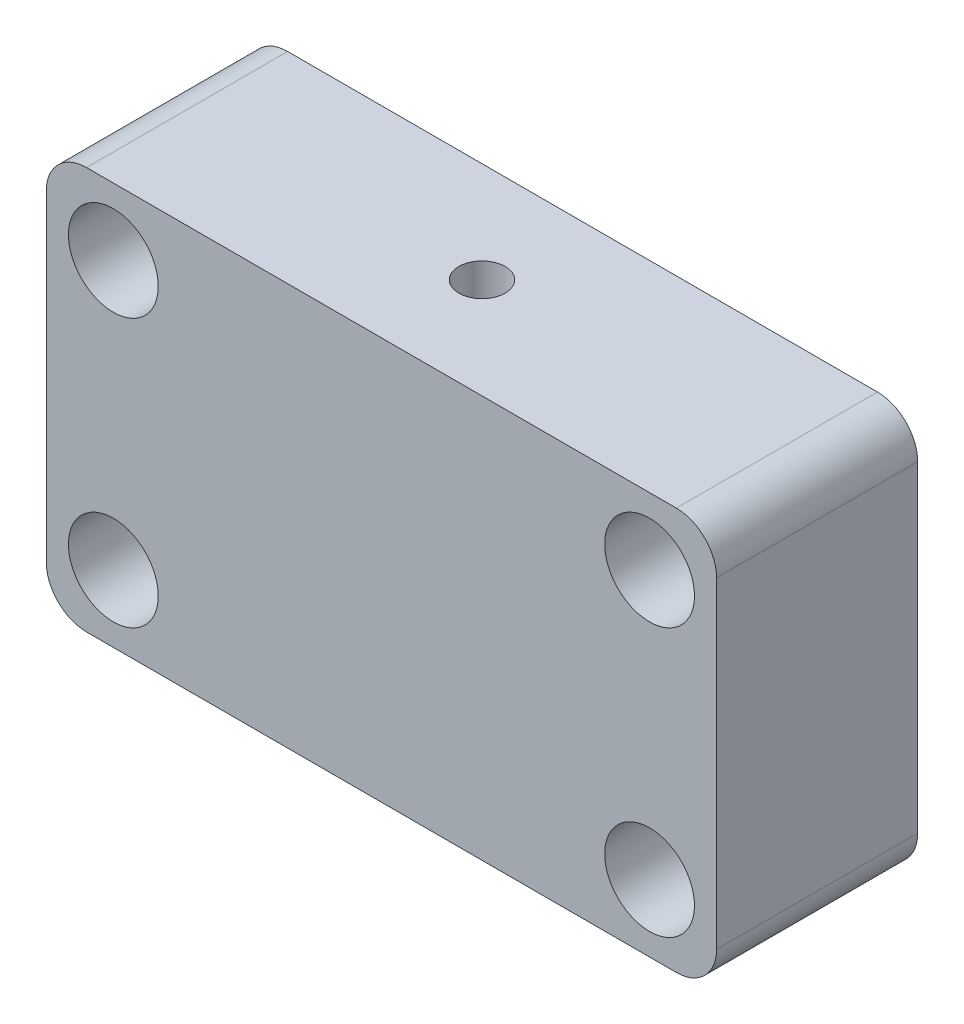
ISO-10303-21;
HEADER;
FILE_DESCRIPTION(('STEP AP214'),'2;1');
FILE_NAME('part.step','',(''),(''),'','','');
FILE_SCHEMA(('AUTOMOTIVE_DESIGN { 1 0 10303 214 1 1 1 1 }'));
ENDSEC;
DATA;
#1=APPLICATION_CONTEXT('core data for automotive mechanical design processes');
#2=APPLICATION_PROTOCOL_DEFINITION('international standard','automotive_design',2000,#1);
#3=PRODUCT_CONTEXT('',#1,'mechanical');
#4=PRODUCT('Part','Part','',(#3));
#5=PRODUCT_RELATED_PRODUCT_CATEGORY('part','',(#4));
#6=PRODUCT_DEFINITION_FORMATION('','',#4);
#7=PRODUCT_DEFINITION_CONTEXT('part definition',#1,'design');
#8=PRODUCT_DEFINITION('design','',#6,#7);
#9=PRODUCT_DEFINITION_SHAPE('','',#8);
#10=(LENGTH_UNIT() NAMED_UNIT(*) SI_UNIT(.MILLI.,.METRE.));
#11=(NAMED_UNIT(*) PLANE_ANGLE_UNIT() SI_UNIT($,.RADIAN.));
#12=(NAMED_UNIT(*) SI_UNIT($,.STERADIAN.) SOLID_ANGLE_UNIT());
#13=UNCERTAINTY_MEASURE_WITH_UNIT(LENGTH_MEASURE(1.E-05),#10,'distance_accuracy_value','');
#14=(GEOMETRIC_REPRESENTATION_CONTEXT(3) GLOBAL_UNCERTAINTY_ASSIGNED_CONTEXT((#13)) GLOBAL_UNIT_ASSIGNED_CONTEXT((#10,
#11,#12)) REPRESENTATION_CONTEXT('',''));
#15=CARTESIAN_POINT('',(0.,0.,0.));
#16=DIRECTION('',(0.,0.,1.));
#17=DIRECTION('',(1.,0.,0.));
#18=AXIS2_PLACEMENT_3D('',#15,#16,#17);
#19=CARTESIAN_POINT('',(0.,0.,15.));
#20=DIRECTION('',(0.,0.,-1.));
#21=DIRECTION('',(-1.,0.,0.));
#22=AXIS2_PLACEMENT_3D('',#19,#20,#21);
#23=PLANE('',#22);
#24=DIRECTION('',(0.,-1.,0.));
#25=VECTOR('',#24,1.);
#26=CARTESIAN_POINT('',(-25.,-15.,15.));
#27=LINE('',#26,#25);
#28=CARTESIAN_POINT('',(-25.,12.,15.));
#29=VERTEX_POINT('',#28);
#30=CARTESIAN_POINT('',(-25.,-12.,15.));
#31=VERTEX_POINT('',#30);
#32=EDGE_CURVE('E148',#29,#31,#27,.T.);
#33=ORIENTED_EDGE('',*,*,#32,.T.);
#34=CARTESIAN_POINT('',(-22.,-12.,15.));
#35=DIRECTION('',(0.,0.,-1.));
#36=DIRECTION('',(-1.,0.,0.));
#37=AXIS2_PLACEMENT_3D('',#34,#35,#36);
#38=CIRCLE('',#37,3.);
#39=CARTESIAN_POINT('',(-22.,-15.,15.));
#40=VERTEX_POINT('',#39);
#41=EDGE_CURVE('E11',#31,#40,#38,.F.);
#42=ORIENTED_EDGE('',*,*,#41,.T.);
#43=DIRECTION('',(1.,0.,0.));
#44=VECTOR('',#43,1.);
#45=CARTESIAN_POINT('',(-25.,-15.,15.));
#46=LINE('',#45,#44);
#47=CARTESIAN_POINT('',(22.,-15.,15.));
#48=VERTEX_POINT('',#47);
#49=EDGE_CURVE('E150',#40,#48,#46,.T.);
#50=ORIENTED_EDGE('',*,*,#49,.T.);
#51=CARTESIAN_POINT('',(22.,-12.,15.));
#52=DIRECTION('',(0.,0.,-1.));
#53=DIRECTION('',(-1.,0.,0.));
#54=AXIS2_PLACEMENT_3D('',#51,#52,#53);
#55=CIRCLE('',#54,3.);
#56=CARTESIAN_POINT('',(25.,-12.,15.));
#57=VERTEX_POINT('',#56);
#58=EDGE_CURVE('E188',#48,#57,#55,.F.);
#59=ORIENTED_EDGE('',*,*,#58,.T.);
#60=DIRECTION('',(0.,1.,0.));
#61=VECTOR('',#60,1.);
#62=CARTESIAN_POINT('',(25.,-15.,15.));
#63=LINE('',#62,#61);
#64=CARTESIAN_POINT('',(25.,12.,15.));
#65=VERTEX_POINT('',#64);
#66=EDGE_CURVE('E142',#57,#65,#63,.T.);
#67=ORIENTED_EDGE('',*,*,#66,.T.);
#68=CARTESIAN_POINT('',(22.,12.,15.));
#69=DIRECTION('',(0.,0.,-1.));
#70=DIRECTION('',(-1.,0.,0.));
#71=AXIS2_PLACEMENT_3D('',#68,#69,#70);
#72=CIRCLE('',#71,3.);
#73=CARTESIAN_POINT('',(22.,15.,15.));
#74=VERTEX_POINT('',#73);
#75=EDGE_CURVE('E168',#65,#74,#72,.F.);
#76=ORIENTED_EDGE('',*,*,#75,.T.);
#77=DIRECTION('',(-1.,0.,0.));
#78=VECTOR('',#77,1.);
#79=CARTESIAN_POINT('',(-25.,15.,15.));
#80=LINE('',#79,#78);
#81=CARTESIAN_POINT('',(-22.,15.,15.));
#82=VERTEX_POINT('',#81);
#83=EDGE_CURVE('E144',#74,#82,#80,.T.);
#84=ORIENTED_EDGE('',*,*,#83,.T.);
#85=CARTESIAN_POINT('',(-22.,12.,15.));
#86=DIRECTION('',(0.,0.,-1.));
#87=DIRECTION('',(-1.,0.,0.));
#88=AXIS2_PLACEMENT_3D('',#85,#86,#87);
#89=CIRCLE('',#88,3.);
#90=EDGE_CURVE('E177',#82,#29,#89,.F.);
#91=ORIENTED_EDGE('',*,*,#90,.T.);
#92=EDGE_LOOP('',(#33,#42,#50,#59,#67,#76,#84,#91));
#93=FACE_BOUND('',#92,.T.);
#94=CARTESIAN_POINT('',(-20.,10.,15.));
#95=DIRECTION('',(0.,0.,1.));
#96=DIRECTION('',(1.,0.,0.));
#97=AXIS2_PLACEMENT_3D('',#94,#95,#96);
#98=CIRCLE('',#97,3.35);
#99=CARTESIAN_POINT('',(-16.65,10.,15.));
#100=VERTEX_POINT('',#99);
#101=EDGE_CURVE('E136',#100,#100,#98,.T.);
#102=ORIENTED_EDGE('',*,*,#101,.F.);
#103=EDGE_LOOP('',(#102));
#104=FACE_BOUND('',#103,.T.);
#105=CARTESIAN_POINT('',(20.,10.,15.));
#106=DIRECTION('',(0.,0.,1.));
#107=DIRECTION('',(1.,0.,0.));
#108=AXIS2_PLACEMENT_3D('',#105,#106,#107);
#109=CIRCLE('',#108,3.35);
#110=CARTESIAN_POINT('',(23.35,10.,15.));
#111=VERTEX_POINT('',#110);
#112=EDGE_CURVE('E130',#111,#111,#109,.T.);
#113=ORIENTED_EDGE('',*,*,#112,.F.);
#114=EDGE_LOOP('',(#113));
#115=FACE_BOUND('',#114,.T.);
#116=CARTESIAN_POINT('',(-20.,-10.,15.));
#117=DIRECTION('',(0.,0.,1.));
#118=DIRECTION('',(1.,0.,0.));
#119=AXIS2_PLACEMENT_3D('',#116,#117,#118);
#120=CIRCLE('',#119,3.35);
#121=CARTESIAN_POINT('',(-16.65,-10.,15.));
#122=VERTEX_POINT('',#121);
#123=EDGE_CURVE('E124',#122,#122,#120,.T.);
#124=ORIENTED_EDGE('',*,*,#123,.F.);
#125=EDGE_LOOP('',(#124));
#126=FACE_BOUND('',#125,.T.);
#127=CARTESIAN_POINT('',(20.,-10.,15.));
#128=DIRECTION('',(0.,0.,1.));
#129=DIRECTION('',(1.,0.,0.));
#130=AXIS2_PLACEMENT_3D('',#127,#128,#129);
#131=CIRCLE('',#130,3.35);
#132=CARTESIAN_POINT('',(23.35,-10.,15.));
#133=VERTEX_POINT('',#132);
#134=EDGE_CURVE('E116',#133,#133,#131,.T.);
#135=ORIENTED_EDGE('',*,*,#134,.F.);
#136=EDGE_LOOP('',(#135));
#137=FACE_BOUND('',#136,.T.);
#138=ADVANCED_FACE('F36',(#93,#104,#115,#126,#137),#23,.F.);
#139=CARTESIAN_POINT('',(0.,0.,0.));
#140=DIRECTION('',(0.,0.,-1.));
#141=DIRECTION('',(-1.,0.,0.));
#142=AXIS2_PLACEMENT_3D('',#139,#140,#141);
#143=PLANE('',#142);
#144=CARTESIAN_POINT('',(-20.,-10.,0.));
#145=DIRECTION('',(0.,0.,1.));
#146=DIRECTION('',(1.,0.,0.));
#147=AXIS2_PLACEMENT_3D('',#144,#145,#146);
#148=CIRCLE('',#147,3.35);
#149=CARTESIAN_POINT('',(-16.65,-10.,0.));
#150=VERTEX_POINT('',#149);
#151=EDGE_CURVE('E122',#150,#150,#148,.T.);
#152=ORIENTED_EDGE('',*,*,#151,.T.);
#153=EDGE_LOOP('',(#152));
#154=FACE_BOUND('',#153,.T.);
#155=CARTESIAN_POINT('',(-20.,10.,0.));
#156=DIRECTION('',(0.,0.,1.));
#157=DIRECTION('',(1.,0.,0.));
#158=AXIS2_PLACEMENT_3D('',#155,#156,#157);
#159=CIRCLE('',#158,3.35);
#160=CARTESIAN_POINT('',(-16.65,10.,0.));
#161=VERTEX_POINT('',#160);
#162=EDGE_CURVE('E133',#161,#161,#159,.T.);
#163=ORIENTED_EDGE('',*,*,#162,.T.);
#164=EDGE_LOOP('',(#163));
#165=FACE_BOUND('',#164,.T.);
#166=DIRECTION('',(1.,0.,0.));
#167=VECTOR('',#166,1.);
#168=CARTESIAN_POINT('',(-25.,-15.,0.));
#169=LINE('',#168,#167);
#170=CARTESIAN_POINT('',(-22.,-15.,0.));
#171=VERTEX_POINT('',#170);
#172=CARTESIAN_POINT('',(22.,-15.,0.));
#173=VERTEX_POINT('',#172);
#174=EDGE_CURVE('E145',#171,#173,#169,.T.);
#175=ORIENTED_EDGE('',*,*,#174,.F.);
#176=CARTESIAN_POINT('',(-22.,-12.,0.));
#177=DIRECTION('',(0.,0.,-1.));
#178=DIRECTION('',(-1.,0.,0.));
#179=AXIS2_PLACEMENT_3D('',#176,#177,#178);
#180=CIRCLE('',#179,3.);
#181=CARTESIAN_POINT('',(-25.,-12.,0.));
#182=VERTEX_POINT('',#181);
#183=EDGE_CURVE('E58',#171,#182,#180,.T.);
#184=ORIENTED_EDGE('',*,*,#183,.T.);
#185=DIRECTION('',(0.,-1.,0.));
#186=VECTOR('',#185,1.);
#187=CARTESIAN_POINT('',(-25.,-15.,0.));
#188=LINE('',#187,#186);
#189=CARTESIAN_POINT('',(-25.,12.,0.));
#190=VERTEX_POINT('',#189);
#191=EDGE_CURVE('E157',#190,#182,#188,.T.);
#192=ORIENTED_EDGE('',*,*,#191,.F.);
#193=CARTESIAN_POINT('',(-22.,12.,0.));
#194=DIRECTION('',(0.,0.,-1.));
#195=DIRECTION('',(-1.,0.,0.));
#196=AXIS2_PLACEMENT_3D('',#193,#194,#195);
#197=CIRCLE('',#196,3.);
#198=CARTESIAN_POINT('',(-22.,15.,0.));
#199=VERTEX_POINT('',#198);
#200=EDGE_CURVE('E173',#190,#199,#197,.T.);
#201=ORIENTED_EDGE('',*,*,#200,.T.);
#202=DIRECTION('',(-1.,0.,0.));
#203=VECTOR('',#202,1.);
#204=CARTESIAN_POINT('',(-25.,15.,0.));
#205=LINE('',#204,#203);
#206=CARTESIAN_POINT('',(22.,15.,0.));
#207=VERTEX_POINT('',#206);
#208=EDGE_CURVE('E154',#207,#199,#205,.T.);
#209=ORIENTED_EDGE('',*,*,#208,.F.);
#210=CARTESIAN_POINT('',(22.,12.,0.));
#211=DIRECTION('',(0.,0.,-1.));
#212=DIRECTION('',(-1.,0.,0.));
#213=AXIS2_PLACEMENT_3D('',#210,#211,#212);
#214=CIRCLE('',#213,3.);
#215=CARTESIAN_POINT('',(25.,12.,0.));
#216=VERTEX_POINT('',#215);
#217=EDGE_CURVE('E162',#207,#216,#214,.T.);
#218=ORIENTED_EDGE('',*,*,#217,.T.);
#219=DIRECTION('',(0.,1.,0.));
#220=VECTOR('',#219,1.);
#221=CARTESIAN_POINT('',(25.,-15.,0.));
#222=LINE('',#221,#220);
#223=CARTESIAN_POINT('',(25.,-12.,0.));
#224=VERTEX_POINT('',#223);
#225=EDGE_CURVE('E139',#224,#216,#222,.T.);
#226=ORIENTED_EDGE('',*,*,#225,.F.);
#227=CARTESIAN_POINT('',(22.,-12.,0.));
#228=DIRECTION('',(0.,0.,-1.));
#229=DIRECTION('',(-1.,0.,0.));
#230=AXIS2_PLACEMENT_3D('',#227,#228,#229);
#231=CIRCLE('',#230,3.);
#232=EDGE_CURVE('E182',#224,#173,#231,.T.);
#233=ORIENTED_EDGE('',*,*,#232,.T.);
#234=EDGE_LOOP('',(#175,#184,#192,#201,#209,#218,#226,#233));
#235=FACE_BOUND('',#234,.T.);
#236=CARTESIAN_POINT('',(20.,10.,0.));
#237=DIRECTION('',(0.,0.,1.));
#238=DIRECTION('',(1.,0.,0.));
#239=AXIS2_PLACEMENT_3D('',#236,#237,#238);
#240=CIRCLE('',#239,3.35);
#241=CARTESIAN_POINT('',(23.35,10.,0.));
#242=VERTEX_POINT('',#241);
#243=EDGE_CURVE('E127',#242,#242,#240,.T.);
#244=ORIENTED_EDGE('',*,*,#243,.T.);
#245=EDGE_LOOP('',(#244));
#246=FACE_BOUND('',#245,.T.);
#247=CARTESIAN_POINT('',(20.,-10.,0.));
#248=DIRECTION('',(0.,0.,1.));
#249=DIRECTION('',(1.,0.,0.));
#250=AXIS2_PLACEMENT_3D('',#247,#248,#249);
#251=CIRCLE('',#250,3.35);
#252=CARTESIAN_POINT('',(23.35,-10.,0.));
#253=VERTEX_POINT('',#252);
#254=EDGE_CURVE('E112',#253,#253,#251,.T.);
#255=ORIENTED_EDGE('',*,*,#254,.T.);
#256=EDGE_LOOP('',(#255));
#257=FACE_BOUND('',#256,.T.);
#258=ADVANCED_FACE('F199',(#154,#165,#235,#246,#257),#143,.T.);
#259=CARTESIAN_POINT('',(25.,-15.,15.));
#260=DIRECTION('',(-1.,0.,0.));
#261=DIRECTION('',(0.,0.,1.));
#262=AXIS2_PLACEMENT_3D('',#259,#260,#261);
#263=PLANE('',#262);
#264=ORIENTED_EDGE('',*,*,#66,.F.);
#265=DIRECTION('',(0.,0.,-1.));
#266=VECTOR('',#265,1.);
#267=CARTESIAN_POINT('',(25.,-12.,15.));
#268=LINE('',#267,#266);
#269=EDGE_CURVE('E179',#57,#224,#268,.T.);
#270=ORIENTED_EDGE('',*,*,#269,.T.);
#271=ORIENTED_EDGE('',*,*,#225,.T.);
#272=DIRECTION('',(0.,0.,-1.));
#273=VECTOR('',#272,1.);
#274=CARTESIAN_POINT('',(25.,12.,15.));
#275=LINE('',#274,#273);
#276=EDGE_CURVE('E165',#216,#65,#275,.F.);
#277=ORIENTED_EDGE('',*,*,#276,.T.);
#278=EDGE_LOOP('',(#264,#270,#271,#277));
#279=FACE_BOUND('',#278,.T.);
#280=ADVANCED_FACE('F211',(#279),#263,.F.);
#281=CARTESIAN_POINT('',(-25.,15.,15.));
#282=DIRECTION('',(0.,-1.,0.));
#283=DIRECTION('',(0.,0.,-1.));
#284=AXIS2_PLACEMENT_3D('',#281,#282,#283);
#285=PLANE('',#284);
#286=CARTESIAN_POINT('',(0.,15.,7.5));
#287=DIRECTION('',(0.,1.,0.));
#288=DIRECTION('',(0.,0.,1.));
#289=AXIS2_PLACEMENT_3D('',#286,#287,#288);
#290=CIRCLE('',#289,1.72719999999999);
#291=CARTESIAN_POINT('',(0.,15.,9.22719999999999));
#292=VERTEX_POINT('',#291);
#293=EDGE_CURVE('E113',#292,#292,#290,.T.);
#294=ORIENTED_EDGE('',*,*,#293,.F.);
#295=EDGE_LOOP('',(#294));
#296=FACE_BOUND('',#295,.T.);
#297=ORIENTED_EDGE('',*,*,#208,.T.);
#298=DIRECTION('',(0.,0.,-1.));
#299=VECTOR('',#298,1.);
#300=CARTESIAN_POINT('',(-22.,15.,15.));
#301=LINE('',#300,#299);
#302=EDGE_CURVE('E175',#199,#82,#301,.F.);
#303=ORIENTED_EDGE('',*,*,#302,.T.);
#304=ORIENTED_EDGE('',*,*,#83,.F.);
#305=DIRECTION('',(0.,0.,-1.));
#306=VECTOR('',#305,1.);
#307=CARTESIAN_POINT('',(22.,15.,15.));
#308=LINE('',#307,#306);
#309=EDGE_CURVE('E152',#74,#207,#308,.T.);
#310=ORIENTED_EDGE('',*,*,#309,.T.);
#311=EDGE_LOOP('',(#297,#303,#304,#310));
#312=FACE_BOUND('',#311,.T.);
#313=ADVANCED_FACE('F220',(#296,#312),#285,.F.);
#314=CARTESIAN_POINT('',(-25.,-15.,15.));
#315=DIRECTION('',(1.,0.,0.));
#316=DIRECTION('',(0.,0.,-1.));
#317=AXIS2_PLACEMENT_3D('',#314,#315,#316);
#318=PLANE('',#317);
#319=ORIENTED_EDGE('',*,*,#191,.T.);
#320=DIRECTION('',(0.,0.,-1.));
#321=VECTOR('',#320,1.);
#322=CARTESIAN_POINT('',(-25.,-12.,15.));
#323=LINE('',#322,#321);
#324=EDGE_CURVE('E44',#182,#31,#323,.F.);
#325=ORIENTED_EDGE('',*,*,#324,.T.);
#326=ORIENTED_EDGE('',*,*,#32,.F.);
#327=DIRECTION('',(0.,0.,-1.));
#328=VECTOR('',#327,1.);
#329=CARTESIAN_POINT('',(-25.,12.,15.));
#330=LINE('',#329,#328);
#331=EDGE_CURVE('E170',#29,#190,#330,.T.);
#332=ORIENTED_EDGE('',*,*,#331,.T.);
#333=EDGE_LOOP('',(#319,#325,#326,#332));
#334=FACE_BOUND('',#333,.T.);
#335=ADVANCED_FACE('F226',(#334),#318,.F.);
#336=CARTESIAN_POINT('',(-25.,-15.,15.));
#337=DIRECTION('',(0.,1.,0.));
#338=DIRECTION('',(0.,0.,1.));
#339=AXIS2_PLACEMENT_3D('',#336,#337,#338);
#340=PLANE('',#339);
#341=ORIENTED_EDGE('',*,*,#49,.F.);
#342=DIRECTION('',(0.,0.,-1.));
#343=VECTOR('',#342,1.);
#344=CARTESIAN_POINT('',(-22.,-15.,15.));
#345=LINE('',#344,#343);
#346=EDGE_CURVE('E190',#40,#171,#345,.T.);
#347=ORIENTED_EDGE('',*,*,#346,.T.);
#348=ORIENTED_EDGE('',*,*,#174,.T.);
#349=DIRECTION('',(0.,0.,-1.));
#350=VECTOR('',#349,1.);
#351=CARTESIAN_POINT('',(22.,-15.,15.));
#352=LINE('',#351,#350);
#353=EDGE_CURVE('E185',#173,#48,#352,.F.);
#354=ORIENTED_EDGE('',*,*,#353,.T.);
#355=EDGE_LOOP('',(#341,#347,#348,#354));
#356=FACE_BOUND('',#355,.T.);
#357=ADVANCED_FACE('F196',(#356),#340,.F.);
#358=CARTESIAN_POINT('',(-20.,10.,15.));
#359=DIRECTION('',(0.,0.,-1.));
#360=DIRECTION('',(-1.,0.,0.));
#361=AXIS2_PLACEMENT_3D('',#358,#359,#360);
#362=CYLINDRICAL_SURFACE('',#361,3.35);
#363=ORIENTED_EDGE('',*,*,#101,.T.);
#364=EDGE_LOOP('',(#363));
#365=FACE_BOUND('',#364,.T.);
#366=ORIENTED_EDGE('',*,*,#162,.F.);
#367=EDGE_LOOP('',(#366));
#368=FACE_BOUND('',#367,.T.);
#369=ADVANCED_FACE('F239',(#365,#368),#362,.F.);
#370=CARTESIAN_POINT('',(20.,10.,15.));
#371=DIRECTION('',(0.,0.,-1.));
#372=DIRECTION('',(-1.,0.,0.));
#373=AXIS2_PLACEMENT_3D('',#370,#371,#372);
#374=CYLINDRICAL_SURFACE('',#373,3.35);
#375=ORIENTED_EDGE('',*,*,#112,.T.);
#376=EDGE_LOOP('',(#375));
#377=FACE_BOUND('',#376,.T.);
#378=ORIENTED_EDGE('',*,*,#243,.F.);
#379=EDGE_LOOP('',(#378));
#380=FACE_BOUND('',#379,.T.);
#381=ADVANCED_FACE('F303',(#377,#380),#374,.F.);
#382=CARTESIAN_POINT('',(-20.,-10.,15.));
#383=DIRECTION('',(0.,0.,-1.));
#384=DIRECTION('',(-1.,0.,0.));
#385=AXIS2_PLACEMENT_3D('',#382,#383,#384);
#386=CYLINDRICAL_SURFACE('',#385,3.35);
#387=ORIENTED_EDGE('',*,*,#123,.T.);
#388=EDGE_LOOP('',(#387));
#389=FACE_BOUND('',#388,.T.);
#390=ORIENTED_EDGE('',*,*,#151,.F.);
#391=EDGE_LOOP('',(#390));
#392=FACE_BOUND('',#391,.T.);
#393=ADVANCED_FACE('F309',(#389,#392),#386,.F.);
#394=CARTESIAN_POINT('',(20.,-10.,15.));
#395=DIRECTION('',(0.,0.,-1.));
#396=DIRECTION('',(-1.,0.,0.));
#397=AXIS2_PLACEMENT_3D('',#394,#395,#396);
#398=CYLINDRICAL_SURFACE('',#397,3.35);
#399=ORIENTED_EDGE('',*,*,#134,.T.);
#400=EDGE_LOOP('',(#399));
#401=FACE_BOUND('',#400,.T.);
#402=ORIENTED_EDGE('',*,*,#254,.F.);
#403=EDGE_LOOP('',(#402));
#404=FACE_BOUND('',#403,.T.);
#405=ADVANCED_FACE('F106',(#401,#404),#398,.F.);
#406=CARTESIAN_POINT('',(0.,10.,7.5));
#407=DIRECTION('',(0.,1.,0.));
#408=DIRECTION('',(0.,0.,1.));
#409=AXIS2_PLACEMENT_3D('',#406,#407,#408);
#410=CONICAL_SURFACE('',#409,1.7272,1.02974425867665);
#411=CARTESIAN_POINT('',(0.,8.96219353881559,7.5));
#412=VERTEX_POINT('',#411);
#413=VERTEX_LOOP('',#412);
#414=FACE_BOUND('',#413,.T.);
#415=CARTESIAN_POINT('',(0.,10.,7.5));
#416=DIRECTION('',(0.,1.,0.));
#417=DIRECTION('',(0.,0.,1.));
#418=AXIS2_PLACEMENT_3D('',#415,#416,#417);
#419=CIRCLE('',#418,1.7272);
#420=CARTESIAN_POINT('',(0.,10.,9.2272));
#421=VERTEX_POINT('',#420);
#422=EDGE_CURVE('E110',#421,#421,#419,.T.);
#423=ORIENTED_EDGE('',*,*,#422,.T.);
#424=EDGE_LOOP('',(#423));
#425=FACE_BOUND('',#424,.T.);
#426=ADVANCED_FACE('F102',(#414,#425),#410,.F.);
#427=CARTESIAN_POINT('',(0.,15.,7.5));
#428=DIRECTION('',(0.,1.,0.));
#429=DIRECTION('',(0.,0.,1.));
#430=AXIS2_PLACEMENT_3D('',#427,#428,#429);
#431=CYLINDRICAL_SURFACE('',#430,1.72719999999999);
#432=ORIENTED_EDGE('',*,*,#422,.F.);
#433=EDGE_LOOP('',(#432));
#434=FACE_BOUND('',#433,.T.);
#435=ORIENTED_EDGE('',*,*,#293,.T.);
#436=EDGE_LOOP('',(#435));
#437=FACE_BOUND('',#436,.T.);
#438=ADVANCED_FACE('F105',(#434,#437),#431,.F.);
#439=CARTESIAN_POINT('',(22.,12.,15.));
#440=DIRECTION('',(0.,0.,-1.));
#441=DIRECTION('',(-1.,0.,0.));
#442=AXIS2_PLACEMENT_3D('',#439,#440,#441);
#443=CYLINDRICAL_SURFACE('',#442,3.);
#444=ORIENTED_EDGE('',*,*,#75,.F.);
#445=ORIENTED_EDGE('',*,*,#276,.F.);
#446=ORIENTED_EDGE('',*,*,#217,.F.);
#447=ORIENTED_EDGE('',*,*,#309,.F.);
#448=EDGE_LOOP('',(#444,#445,#446,#447));
#449=FACE_BOUND('',#448,.T.);
#450=ADVANCED_FACE('F216',(#449),#443,.T.);
#451=CARTESIAN_POINT('',(-22.,12.,15.));
#452=DIRECTION('',(0.,0.,-1.));
#453=DIRECTION('',(-1.,0.,0.));
#454=AXIS2_PLACEMENT_3D('',#451,#452,#453);
#455=CYLINDRICAL_SURFACE('',#454,3.);
#456=ORIENTED_EDGE('',*,*,#90,.F.);
#457=ORIENTED_EDGE('',*,*,#302,.F.);
#458=ORIENTED_EDGE('',*,*,#200,.F.);
#459=ORIENTED_EDGE('',*,*,#331,.F.);
#460=EDGE_LOOP('',(#456,#457,#458,#459));
#461=FACE_BOUND('',#460,.T.);
#462=ADVANCED_FACE('F224',(#461),#455,.T.);
#463=CARTESIAN_POINT('',(22.,-12.,15.));
#464=DIRECTION('',(0.,0.,-1.));
#465=DIRECTION('',(-1.,0.,0.));
#466=AXIS2_PLACEMENT_3D('',#463,#464,#465);
#467=CYLINDRICAL_SURFACE('',#466,3.);
#468=ORIENTED_EDGE('',*,*,#58,.F.);
#469=ORIENTED_EDGE('',*,*,#353,.F.);
#470=ORIENTED_EDGE('',*,*,#232,.F.);
#471=ORIENTED_EDGE('',*,*,#269,.F.);
#472=EDGE_LOOP('',(#468,#469,#470,#471));
#473=FACE_BOUND('',#472,.T.);
#474=ADVANCED_FACE('F206',(#473),#467,.T.);
#475=CARTESIAN_POINT('',(-22.,-12.,15.));
#476=DIRECTION('',(0.,0.,-1.));
#477=DIRECTION('',(-1.,0.,0.));
#478=AXIS2_PLACEMENT_3D('',#475,#476,#477);
#479=CYLINDRICAL_SURFACE('',#478,3.);
#480=ORIENTED_EDGE('',*,*,#41,.F.);
#481=ORIENTED_EDGE('',*,*,#324,.F.);
#482=ORIENTED_EDGE('',*,*,#183,.F.);
#483=ORIENTED_EDGE('',*,*,#346,.F.);
#484=EDGE_LOOP('',(#480,#481,#482,#483));
#485=FACE_BOUND('',#484,.T.);
#486=ADVANCED_FACE('F38',(#485),#479,.T.);
#487=CLOSED_SHELL('',(#138,#258,#280,#313,#335,#357,#369,#381,#393,#405,#426,#438,#450,#462,
#474,#486));
#488=MANIFOLD_SOLID_BREP('B2',#487);
#489=ADVANCED_BREP_SHAPE_REPRESENTATION('',(#18,#488),#14);
#490=SHAPE_DEFINITION_REPRESENTATION(#9,#489);
ENDSEC;
END-ISO-10303-21;
